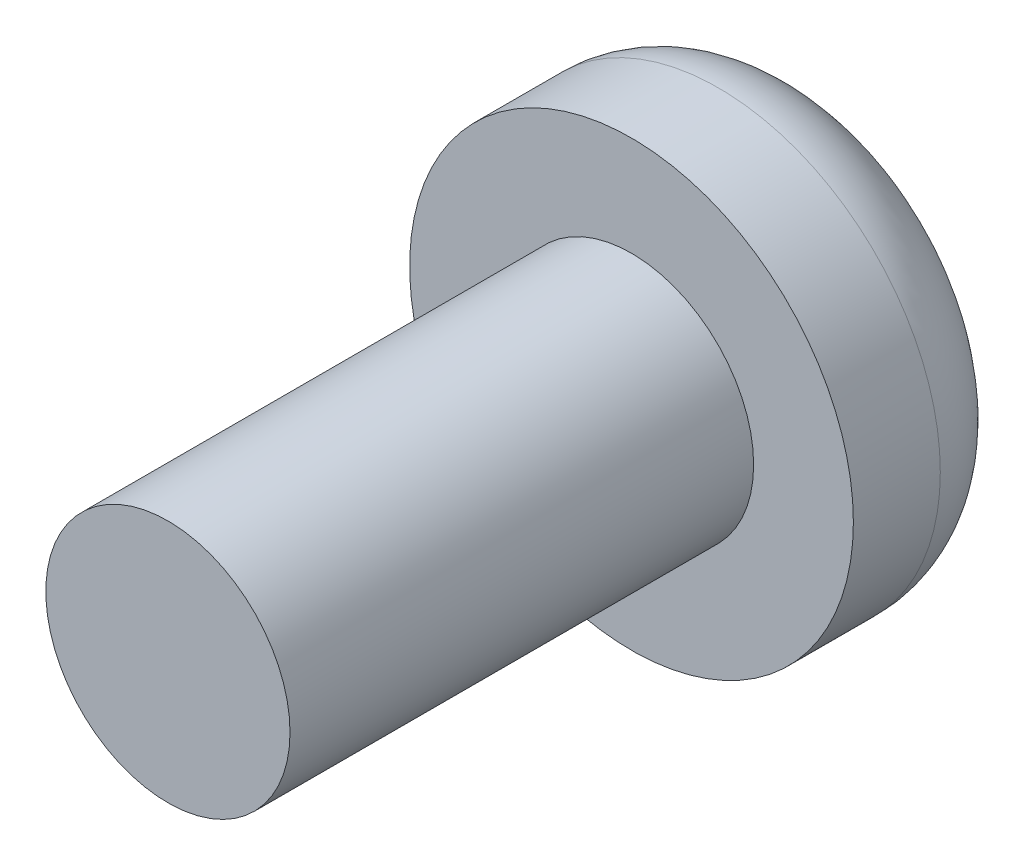
ISO-10303-21;
HEADER;
FILE_DESCRIPTION(('STEP AP214'),'2;1');
FILE_NAME('part.step','',(''),(''),'','','');
FILE_SCHEMA(('AUTOMOTIVE_DESIGN { 1 0 10303 214 1 1 1 1 }'));
ENDSEC;
DATA;
#1=APPLICATION_CONTEXT('core data for automotive mechanical design processes');
#2=APPLICATION_PROTOCOL_DEFINITION('international standard','automotive_design',2000,#1);
#3=PRODUCT_CONTEXT('',#1,'mechanical');
#4=PRODUCT('Part','Part','',(#3));
#5=PRODUCT_RELATED_PRODUCT_CATEGORY('part','',(#4));
#6=PRODUCT_DEFINITION_FORMATION('','',#4);
#7=PRODUCT_DEFINITION_CONTEXT('part definition',#1,'design');
#8=PRODUCT_DEFINITION('design','',#6,#7);
#9=PRODUCT_DEFINITION_SHAPE('','',#8);
#10=(LENGTH_UNIT() NAMED_UNIT(*) SI_UNIT(.MILLI.,.METRE.));
#11=(NAMED_UNIT(*) PLANE_ANGLE_UNIT() SI_UNIT($,.RADIAN.));
#12=(NAMED_UNIT(*) SI_UNIT($,.STERADIAN.) SOLID_ANGLE_UNIT());
#13=UNCERTAINTY_MEASURE_WITH_UNIT(LENGTH_MEASURE(1.E-05),#10,'distance_accuracy_value','');
#14=(GEOMETRIC_REPRESENTATION_CONTEXT(3) GLOBAL_UNCERTAINTY_ASSIGNED_CONTEXT((#13)) GLOBAL_UNIT_ASSIGNED_CONTEXT((#10,
#11,#12)) REPRESENTATION_CONTEXT('',''));
#15=CARTESIAN_POINT('',(0.,0.,0.));
#16=DIRECTION('',(0.,0.,1.));
#17=DIRECTION('',(1.,0.,0.));
#18=AXIS2_PLACEMENT_3D('',#15,#16,#17);
#19=CARTESIAN_POINT('',(0.,0.,5.6));
#20=DIRECTION('',(0.,0.,-1.));
#21=DIRECTION('',(-1.,0.,0.));
#22=AXIS2_PLACEMENT_3D('',#19,#20,#21);
#23=CYLINDRICAL_SURFACE('',#22,1.475);
#24=CARTESIAN_POINT('',(0.,0.,5.6));
#25=DIRECTION('',(0.,0.,1.));
#26=DIRECTION('',(1.,0.,0.));
#27=AXIS2_PLACEMENT_3D('',#24,#25,#26);
#28=CIRCLE('',#27,1.475);
#29=CARTESIAN_POINT('',(1.475,0.,5.6));
#30=VERTEX_POINT('',#29);
#31=EDGE_CURVE('E145',#30,#30,#28,.T.);
#32=ORIENTED_EDGE('',*,*,#31,.F.);
#33=EDGE_LOOP('',(#32));
#34=FACE_BOUND('',#33,.T.);
#35=CARTESIAN_POINT('',(0.,0.,0.));
#36=DIRECTION('',(0.,0.,1.));
#37=DIRECTION('',(1.,0.,0.));
#38=AXIS2_PLACEMENT_3D('',#35,#36,#37);
#39=CIRCLE('',#38,1.475);
#40=CARTESIAN_POINT('',(1.475,0.,0.));
#41=VERTEX_POINT('',#40);
#42=EDGE_CURVE('E144',#41,#41,#39,.T.);
#43=ORIENTED_EDGE('',*,*,#42,.T.);
#44=EDGE_LOOP('',(#43));
#45=FACE_BOUND('',#44,.T.);
#46=ADVANCED_FACE('F34',(#34,#45),#23,.T.);
#47=CARTESIAN_POINT('',(0.,0.,5.6));
#48=DIRECTION('',(0.,0.,1.));
#49=DIRECTION('',(1.,0.,0.));
#50=AXIS2_PLACEMENT_3D('',#47,#48,#49);
#51=PLANE('',#50);
#52=ORIENTED_EDGE('',*,*,#31,.T.);
#53=EDGE_LOOP('',(#52));
#54=FACE_BOUND('',#53,.T.);
#55=ADVANCED_FACE('F164',(#54),#51,.T.);
#56=CARTESIAN_POINT('',(0.,0.,-2.15));
#57=DIRECTION('',(0.,0.,1.));
#58=DIRECTION('',(1.,0.,0.));
#59=AXIS2_PLACEMENT_3D('',#56,#57,#58);
#60=CYLINDRICAL_SURFACE('',#59,2.68);
#61=CARTESIAN_POINT('',(0.,0.,-1.05));
#62=DIRECTION('',(0.,0.,-1.));
#63=DIRECTION('',(-1.,0.,0.));
#64=AXIS2_PLACEMENT_3D('',#61,#62,#63);
#65=CIRCLE('',#64,2.68);
#66=CARTESIAN_POINT('',(2.68,0.,-1.05));
#67=VERTEX_POINT('',#66);
#68=EDGE_CURVE('E11',#67,#67,#65,.F.);
#69=CARTESIAN_POINT('',(0.,0.,0.));
#70=DIRECTION('',(0.,0.,-1.));
#71=DIRECTION('',(-1.,0.,0.));
#72=AXIS2_PLACEMENT_3D('',#69,#70,#71);
#73=CIRCLE('',#72,2.68);
#74=CARTESIAN_POINT('',(2.68,0.,0.));
#75=VERTEX_POINT('',#74);
#76=EDGE_CURVE('E136',#75,#75,#73,.T.);
#77=CARTESIAN_POINT('',(2.68,0.,-1.05));
#78=CARTESIAN_POINT('',(2.68,0.,-1.0390625));
#79=CARTESIAN_POINT('',(2.68,0.,-1.028125));
#80=CARTESIAN_POINT('',(2.68,0.,-1.00625));
#81=CARTESIAN_POINT('',(2.68,0.,-0.995312499999999));
#82=CARTESIAN_POINT('',(2.68,0.,-0.9734375));
#83=CARTESIAN_POINT('',(2.68,0.,-0.962499999999999));
#84=CARTESIAN_POINT('',(2.68,0.,-0.940624999999999));
#85=CARTESIAN_POINT('',(2.68,0.,-0.929687499999999));
#86=CARTESIAN_POINT('',(2.68,0.,-0.907812499999999));
#87=CARTESIAN_POINT('',(2.68,0.,-0.896874999999999));
#88=CARTESIAN_POINT('',(2.68,0.,-0.874999999999999));
#89=CARTESIAN_POINT('',(2.68,0.,-0.8640625));
#90=CARTESIAN_POINT('',(2.68,0.,-0.8421875));
#91=CARTESIAN_POINT('',(2.68,0.,-0.831249999999999));
#92=CARTESIAN_POINT('',(2.68,0.,-0.809374999999999));
#93=CARTESIAN_POINT('',(2.68,0.,-0.798437499999999));
#94=CARTESIAN_POINT('',(2.68,0.,-0.776562499999999));
#95=CARTESIAN_POINT('',(2.68,0.,-0.765624999999999));
#96=CARTESIAN_POINT('',(2.68,0.,-0.743749999999999));
#97=CARTESIAN_POINT('',(2.68,0.,-0.732812499999999));
#98=CARTESIAN_POINT('',(2.68,0.,-0.710937499999999));
#99=CARTESIAN_POINT('',(2.68,0.,-0.699999999999999));
#100=CARTESIAN_POINT('',(2.68,0.,-0.678124999999999));
#101=CARTESIAN_POINT('',(2.68,0.,-0.667187499999999));
#102=CARTESIAN_POINT('',(2.68,0.,-0.6453125));
#103=CARTESIAN_POINT('',(2.68,0.,-0.634374999999999));
#104=CARTESIAN_POINT('',(2.68,0.,-0.612499999999999));
#105=CARTESIAN_POINT('',(2.68,0.,-0.601562499999999));
#106=CARTESIAN_POINT('',(2.68,0.,-0.579687499999999));
#107=CARTESIAN_POINT('',(2.68,0.,-0.56875));
#108=CARTESIAN_POINT('',(2.68,0.,-0.546875));
#109=CARTESIAN_POINT('',(2.68,0.,-0.535937499999999));
#110=CARTESIAN_POINT('',(2.68,0.,-0.514062499999999));
#111=CARTESIAN_POINT('',(2.68,0.,-0.503124999999999));
#112=CARTESIAN_POINT('',(2.68,0.,-0.481249999999999));
#113=CARTESIAN_POINT('',(2.68,0.,-0.470312499999999));
#114=CARTESIAN_POINT('',(2.68,0.,-0.448437499999999));
#115=CARTESIAN_POINT('',(2.68,0.,-0.437499999999999));
#116=CARTESIAN_POINT('',(2.68,0.,-0.415624999999999));
#117=CARTESIAN_POINT('',(2.68,0.,-0.404687499999999));
#118=CARTESIAN_POINT('',(2.68,0.,-0.382812499999999));
#119=CARTESIAN_POINT('',(2.68,0.,-0.371874999999999));
#120=CARTESIAN_POINT('',(2.68,0.,-0.349999999999999));
#121=CARTESIAN_POINT('',(2.68,0.,-0.339062499999999));
#122=CARTESIAN_POINT('',(2.68,0.,-0.317187499999999));
#123=CARTESIAN_POINT('',(2.68,0.,-0.306249999999999));
#124=CARTESIAN_POINT('',(2.68,0.,-0.284374999999999));
#125=CARTESIAN_POINT('',(2.68,0.,-0.273437499999999));
#126=CARTESIAN_POINT('',(2.68,0.,-0.251562499999999));
#127=CARTESIAN_POINT('',(2.68,0.,-0.240624999999999));
#128=CARTESIAN_POINT('',(2.68,0.,-0.218749999999999));
#129=CARTESIAN_POINT('',(2.68,0.,-0.2078125));
#130=CARTESIAN_POINT('',(2.68,0.,-0.1859375));
#131=CARTESIAN_POINT('',(2.68,0.,-0.175));
#132=CARTESIAN_POINT('',(2.68,0.,-0.153125));
#133=CARTESIAN_POINT('',(2.68,0.,-0.1421875));
#134=CARTESIAN_POINT('',(2.68,0.,-0.1203125));
#135=CARTESIAN_POINT('',(2.68,0.,-0.109375));
#136=CARTESIAN_POINT('',(2.68,0.,-0.0874999999999995));
#137=CARTESIAN_POINT('',(2.68,0.,-0.0765624999999994));
#138=CARTESIAN_POINT('',(2.68,0.,-0.0546874999999993));
#139=CARTESIAN_POINT('',(2.68,0.,-0.0437499999999994));
#140=CARTESIAN_POINT('',(2.68,0.,-0.0218749999999995));
#141=CARTESIAN_POINT('',(2.68,0.,-0.0109374999999995));
#142=CARTESIAN_POINT('',(2.68,0.,0.));
#143=B_SPLINE_CURVE_WITH_KNOTS('',3,(#77,#78,#79,#80,#81,#82,#83,#84,#85,#86,#87,#88,#89,#90,
#91,#92,#93,#94,#95,#96,#97,#98,#99,#100,#101,#102,#103,#104,#105,#106,#107,#108,#109,#110,#111,
#112,#113,#114,#115,#116,#117,#118,#119,#120,#121,#122,#123,#124,#125,#126,#127,#128,#129,#130,
#131,#132,#133,#134,#135,#136,#137,#138,#139,#140,#141,#142),.UNSPECIFIED.,.F.,.F.,(4,2,2,2,2,2,
2,2,2,2,2,2,2,2,2,2,2,2,2,2,2,2,2,2,2,2,2,2,2,2,2,2,4),(0.,0.0328125000000001,
0.0656249999999999,0.0984375,0.13125,0.1640625,0.196875,0.2296875,0.2625,0.2953125,0.328125,
0.3609375,0.39375,0.4265625,0.459375,0.4921875,0.525,0.5578125,0.590625,0.6234375,0.65625,
0.6890625,0.721875,0.7546875,0.7875,0.8203125,0.853125,0.8859375,0.91875,0.9515625,0.984375,
1.0171875,1.05),.UNSPECIFIED.);
#144=EDGE_CURVE('BSEAM169',#67,#75,#143,.T.);
#145=ORIENTED_EDGE('',*,*,#68,.T.);
#146=ORIENTED_EDGE('',*,*,#76,.T.);
#147=ORIENTED_EDGE('',*,*,#144,.T.);
#148=ORIENTED_EDGE('',*,*,#144,.F.);
#149=EDGE_LOOP('',(#145,#147,#146,#148));
#150=FACE_BOUND('',#149,.T.);
#151=ADVANCED_FACE('F169',(#150),#60,.T.);
#152=CARTESIAN_POINT('',(0.,0.,-2.15));
#153=DIRECTION('',(0.,0.,-1.));
#154=DIRECTION('',(-1.,0.,0.));
#155=AXIS2_PLACEMENT_3D('',#152,#153,#154);
#156=PLANE('',#155);
#157=CARTESIAN_POINT('',(0.,0.,-2.15));
#158=DIRECTION('',(0.,0.,-1.));
#159=DIRECTION('',(-1.,0.,0.));
#160=AXIS2_PLACEMENT_3D('',#157,#158,#159);
#161=CIRCLE('',#160,1.58);
#162=CARTESIAN_POINT('',(-1.58,0.,-2.15));
#163=VERTEX_POINT('',#162);
#164=EDGE_CURVE('E42',#163,#163,#161,.T.);
#165=ORIENTED_EDGE('',*,*,#164,.T.);
#166=EDGE_LOOP('',(#165));
#167=FACE_BOUND('',#166,.T.);
#168=DIRECTION('',(-0.866025403784439,-0.5,0.));
#169=VECTOR('',#168,1.);
#170=CARTESIAN_POINT('',(1.22949557445146,-0.709849600877006,-2.15));
#171=LINE('',#170,#169);
#172=CARTESIAN_POINT('',(1.22949557445146,-0.709849600877006,-2.15));
#173=VERTEX_POINT('',#172);
#174=CARTESIAN_POINT('',(0.,-1.41969920175401,-2.15));
#175=VERTEX_POINT('',#174);
#176=EDGE_CURVE('E49',#173,#175,#171,.T.);
#177=ORIENTED_EDGE('',*,*,#176,.F.);
#178=DIRECTION('',(0.,-1.,0.));
#179=VECTOR('',#178,1.);
#180=CARTESIAN_POINT('',(1.22949557445146,0.709849600877006,-2.15));
#181=LINE('',#180,#179);
#182=CARTESIAN_POINT('',(1.22949557445146,0.709849600877006,-2.15));
#183=VERTEX_POINT('',#182);
#184=EDGE_CURVE('E132',#183,#173,#181,.T.);
#185=ORIENTED_EDGE('',*,*,#184,.F.);
#186=DIRECTION('',(0.866025403784438,-0.5,0.));
#187=VECTOR('',#186,1.);
#188=CARTESIAN_POINT('',(0.,1.41969920175401,-2.15));
#189=LINE('',#188,#187);
#190=CARTESIAN_POINT('',(0.,1.41969920175401,-2.15));
#191=VERTEX_POINT('',#190);
#192=EDGE_CURVE('E130',#191,#183,#189,.T.);
#193=ORIENTED_EDGE('',*,*,#192,.F.);
#194=DIRECTION('',(0.866025403784439,0.5,0.));
#195=VECTOR('',#194,1.);
#196=CARTESIAN_POINT('',(-1.22949557445146,0.709849600877006,-2.15));
#197=LINE('',#196,#195);
#198=CARTESIAN_POINT('',(-1.22949557445146,0.709849600877006,-2.15));
#199=VERTEX_POINT('',#198);
#200=EDGE_CURVE('E97',#199,#191,#197,.T.);
#201=ORIENTED_EDGE('',*,*,#200,.F.);
#202=DIRECTION('',(0.,1.,0.));
#203=VECTOR('',#202,1.);
#204=CARTESIAN_POINT('',(-1.22949557445146,-0.709849600877006,-2.15));
#205=LINE('',#204,#203);
#206=CARTESIAN_POINT('',(-1.22949557445146,-0.709849600877006,-2.15));
#207=VERTEX_POINT('',#206);
#208=EDGE_CURVE('E126',#207,#199,#205,.T.);
#209=ORIENTED_EDGE('',*,*,#208,.F.);
#210=DIRECTION('',(-0.866025403784439,0.5,0.));
#211=VECTOR('',#210,1.);
#212=CARTESIAN_POINT('',(0.,-1.41969920175401,-2.15));
#213=LINE('',#212,#211);
#214=EDGE_CURVE('E123',#175,#207,#213,.T.);
#215=ORIENTED_EDGE('',*,*,#214,.F.);
#216=EDGE_LOOP('',(#177,#185,#193,#201,#209,#215));
#217=FACE_BOUND('',#216,.T.);
#218=ADVANCED_FACE('F152',(#167,#217),#156,.T.);
#219=CARTESIAN_POINT('',(0.,0.,0.));
#220=DIRECTION('',(0.,0.,-1.));
#221=DIRECTION('',(-1.,0.,0.));
#222=AXIS2_PLACEMENT_3D('',#219,#220,#221);
#223=PLANE('',#222);
#224=ORIENTED_EDGE('',*,*,#42,.F.);
#225=EDGE_LOOP('',(#224));
#226=FACE_BOUND('',#225,.T.);
#227=ORIENTED_EDGE('',*,*,#76,.F.);
#228=EDGE_LOOP('',(#227));
#229=FACE_BOUND('',#228,.T.);
#230=ADVANCED_FACE('F178',(#226,#229),#223,.F.);
#231=CARTESIAN_POINT('',(1.22949557445146,-0.709849600877006,-0.65));
#232=DIRECTION('',(0.5,-0.866025403784438,0.));
#233=DIRECTION('',(0.866025403784439,0.5,0.));
#234=AXIS2_PLACEMENT_3D('',#231,#232,#233);
#235=PLANE('',#234);
#236=ORIENTED_EDGE('',*,*,#176,.T.);
#237=DIRECTION('',(0.,0.,-1.));
#238=VECTOR('',#237,1.);
#239=CARTESIAN_POINT('',(0.,-1.41969920175401,-0.65));
#240=LINE('',#239,#238);
#241=CARTESIAN_POINT('',(0.,-1.41969920175401,-0.65));
#242=VERTEX_POINT('',#241);
#243=EDGE_CURVE('E79',#242,#175,#240,.T.);
#244=ORIENTED_EDGE('',*,*,#243,.F.);
#245=DIRECTION('',(-0.866025403784439,-0.5,0.));
#246=VECTOR('',#245,1.);
#247=CARTESIAN_POINT('',(1.22949557445146,-0.709849600877006,-0.65));
#248=LINE('',#247,#246);
#249=CARTESIAN_POINT('',(1.22949557445146,-0.709849600877006,-0.65));
#250=VERTEX_POINT('',#249);
#251=EDGE_CURVE('E134',#250,#242,#248,.T.);
#252=ORIENTED_EDGE('',*,*,#251,.F.);
#253=DIRECTION('',(0.,0.,-1.));
#254=VECTOR('',#253,1.);
#255=CARTESIAN_POINT('',(1.22949557445146,-0.709849600877006,-0.65));
#256=LINE('',#255,#254);
#257=EDGE_CURVE('E57',#250,#173,#256,.T.);
#258=ORIENTED_EDGE('',*,*,#257,.T.);
#259=EDGE_LOOP('',(#236,#244,#252,#258));
#260=FACE_BOUND('',#259,.T.);
#261=ADVANCED_FACE('F181',(#260),#235,.F.);
#262=CARTESIAN_POINT('',(1.22949557445146,0.709849600877006,-0.65));
#263=DIRECTION('',(1.,0.,0.));
#264=DIRECTION('',(0.,1.,0.));
#265=AXIS2_PLACEMENT_3D('',#262,#263,#264);
#266=PLANE('',#265);
#267=ORIENTED_EDGE('',*,*,#184,.T.);
#268=ORIENTED_EDGE('',*,*,#257,.F.);
#269=DIRECTION('',(0.,-1.,0.));
#270=VECTOR('',#269,1.);
#271=CARTESIAN_POINT('',(1.22949557445146,0.709849600877006,-0.65));
#272=LINE('',#271,#270);
#273=CARTESIAN_POINT('',(1.22949557445146,0.709849600877006,-0.65));
#274=VERTEX_POINT('',#273);
#275=EDGE_CURVE('E109',#274,#250,#272,.T.);
#276=ORIENTED_EDGE('',*,*,#275,.F.);
#277=DIRECTION('',(0.,0.,-1.));
#278=VECTOR('',#277,1.);
#279=CARTESIAN_POINT('',(1.22949557445146,0.709849600877006,-0.65));
#280=LINE('',#279,#278);
#281=EDGE_CURVE('E101',#274,#183,#280,.T.);
#282=ORIENTED_EDGE('',*,*,#281,.T.);
#283=EDGE_LOOP('',(#267,#268,#276,#282));
#284=FACE_BOUND('',#283,.T.);
#285=ADVANCED_FACE('F187',(#284),#266,.F.);
#286=CARTESIAN_POINT('',(0.,1.41969920175401,-0.65));
#287=DIRECTION('',(0.5,0.866025403784439,0.));
#288=DIRECTION('',(-0.866025403784439,0.5,0.));
#289=AXIS2_PLACEMENT_3D('',#286,#287,#288);
#290=PLANE('',#289);
#291=ORIENTED_EDGE('',*,*,#192,.T.);
#292=ORIENTED_EDGE('',*,*,#281,.F.);
#293=DIRECTION('',(0.866025403784438,-0.5,0.));
#294=VECTOR('',#293,1.);
#295=CARTESIAN_POINT('',(0.,1.41969920175401,-0.65));
#296=LINE('',#295,#294);
#297=CARTESIAN_POINT('',(0.,1.41969920175401,-0.65));
#298=VERTEX_POINT('',#297);
#299=EDGE_CURVE('E105',#298,#274,#296,.T.);
#300=ORIENTED_EDGE('',*,*,#299,.F.);
#301=DIRECTION('',(0.,0.,-1.));
#302=VECTOR('',#301,1.);
#303=CARTESIAN_POINT('',(0.,1.41969920175401,-0.65));
#304=LINE('',#303,#302);
#305=EDGE_CURVE('E90',#298,#191,#304,.T.);
#306=ORIENTED_EDGE('',*,*,#305,.T.);
#307=EDGE_LOOP('',(#291,#292,#300,#306));
#308=FACE_BOUND('',#307,.T.);
#309=ADVANCED_FACE('F106',(#308),#290,.F.);
#310=CARTESIAN_POINT('',(-1.22949557445146,0.709849600877006,-0.65));
#311=DIRECTION('',(-0.5,0.866025403784438,0.));
#312=DIRECTION('',(-0.866025403784439,-0.5,0.));
#313=AXIS2_PLACEMENT_3D('',#310,#311,#312);
#314=PLANE('',#313);
#315=ORIENTED_EDGE('',*,*,#200,.T.);
#316=ORIENTED_EDGE('',*,*,#305,.F.);
#317=DIRECTION('',(0.866025403784439,0.5,0.));
#318=VECTOR('',#317,1.);
#319=CARTESIAN_POINT('',(-1.22949557445146,0.709849600877006,-0.65));
#320=LINE('',#319,#318);
#321=CARTESIAN_POINT('',(-1.22949557445146,0.709849600877006,-0.65));
#322=VERTEX_POINT('',#321);
#323=EDGE_CURVE('E94',#322,#298,#320,.T.);
#324=ORIENTED_EDGE('',*,*,#323,.F.);
#325=DIRECTION('',(0.,0.,-1.));
#326=VECTOR('',#325,1.);
#327=CARTESIAN_POINT('',(-1.22949557445146,0.709849600877006,-0.65));
#328=LINE('',#327,#326);
#329=EDGE_CURVE('E102',#322,#199,#328,.T.);
#330=ORIENTED_EDGE('',*,*,#329,.T.);
#331=EDGE_LOOP('',(#315,#316,#324,#330));
#332=FACE_BOUND('',#331,.T.);
#333=ADVANCED_FACE('F92',(#332),#314,.F.);
#334=CARTESIAN_POINT('',(-1.22949557445146,-0.709849600877006,-0.65));
#335=DIRECTION('',(-1.,0.,0.));
#336=DIRECTION('',(0.,-1.,0.));
#337=AXIS2_PLACEMENT_3D('',#334,#335,#336);
#338=PLANE('',#337);
#339=ORIENTED_EDGE('',*,*,#208,.T.);
#340=ORIENTED_EDGE('',*,*,#329,.F.);
#341=DIRECTION('',(0.,1.,0.));
#342=VECTOR('',#341,1.);
#343=CARTESIAN_POINT('',(-1.22949557445146,-0.709849600877006,-0.65));
#344=LINE('',#343,#342);
#345=CARTESIAN_POINT('',(-1.22949557445146,-0.709849600877006,-0.65));
#346=VERTEX_POINT('',#345);
#347=EDGE_CURVE('E115',#346,#322,#344,.T.);
#348=ORIENTED_EDGE('',*,*,#347,.F.);
#349=DIRECTION('',(0.,0.,-1.));
#350=VECTOR('',#349,1.);
#351=CARTESIAN_POINT('',(-1.22949557445146,-0.709849600877006,-0.65));
#352=LINE('',#351,#350);
#353=EDGE_CURVE('E139',#346,#207,#352,.T.);
#354=ORIENTED_EDGE('',*,*,#353,.T.);
#355=EDGE_LOOP('',(#339,#340,#348,#354));
#356=FACE_BOUND('',#355,.T.);
#357=ADVANCED_FACE('F190',(#356),#338,.F.);
#358=CARTESIAN_POINT('',(0.,-1.41969920175401,-0.65));
#359=DIRECTION('',(-0.5,-0.866025403784438,0.));
#360=DIRECTION('',(0.866025403784439,-0.5,0.));
#361=AXIS2_PLACEMENT_3D('',#358,#359,#360);
#362=PLANE('',#361);
#363=ORIENTED_EDGE('',*,*,#214,.T.);
#364=ORIENTED_EDGE('',*,*,#353,.F.);
#365=DIRECTION('',(-0.866025403784439,0.5,0.));
#366=VECTOR('',#365,1.);
#367=CARTESIAN_POINT('',(0.,-1.41969920175401,-0.65));
#368=LINE('',#367,#366);
#369=EDGE_CURVE('E117',#242,#346,#368,.T.);
#370=ORIENTED_EDGE('',*,*,#369,.F.);
#371=ORIENTED_EDGE('',*,*,#243,.T.);
#372=EDGE_LOOP('',(#363,#364,#370,#371));
#373=FACE_BOUND('',#372,.T.);
#374=ADVANCED_FACE('F160',(#373),#362,.F.);
#375=CARTESIAN_POINT('',(0.,0.,-0.65));
#376=DIRECTION('',(0.,0.,-1.));
#377=DIRECTION('',(-1.,0.,0.));
#378=AXIS2_PLACEMENT_3D('',#375,#376,#377);
#379=PLANE('',#378);
#380=ORIENTED_EDGE('',*,*,#251,.T.);
#381=ORIENTED_EDGE('',*,*,#369,.T.);
#382=ORIENTED_EDGE('',*,*,#347,.T.);
#383=ORIENTED_EDGE('',*,*,#323,.T.);
#384=ORIENTED_EDGE('',*,*,#299,.T.);
#385=ORIENTED_EDGE('',*,*,#275,.T.);
#386=EDGE_LOOP('',(#380,#381,#382,#383,#384,#385));
#387=FACE_BOUND('',#386,.T.);
#388=ADVANCED_FACE('F112',(#387),#379,.T.);
#389=CARTESIAN_POINT('',(0.,0.,-1.05));
#390=DIRECTION('',(0.,0.,-1.));
#391=DIRECTION('',(-1.,0.,0.));
#392=AXIS2_PLACEMENT_3D('',#389,#390,#391);
#393=TOROIDAL_SURFACE('',#392,1.58,1.1);
#394=ORIENTED_EDGE('',*,*,#68,.F.);
#395=EDGE_LOOP('',(#394));
#396=FACE_BOUND('',#395,.T.);
#397=ORIENTED_EDGE('',*,*,#164,.F.);
#398=EDGE_LOOP('',(#397));
#399=FACE_BOUND('',#398,.T.);
#400=ADVANCED_FACE('F36',(#396,#399),#393,.T.);
#401=CLOSED_SHELL('',(#46,#55,#151,#218,#230,#261,#285,#309,#333,#357,#374,#388,#400));
#402=MANIFOLD_SOLID_BREP('B2',#401);
#403=ADVANCED_BREP_SHAPE_REPRESENTATION('',(#18,#402),#14);
#404=SHAPE_DEFINITION_REPRESENTATION(#9,#403);
ENDSEC;
END-ISO-10303-21;
